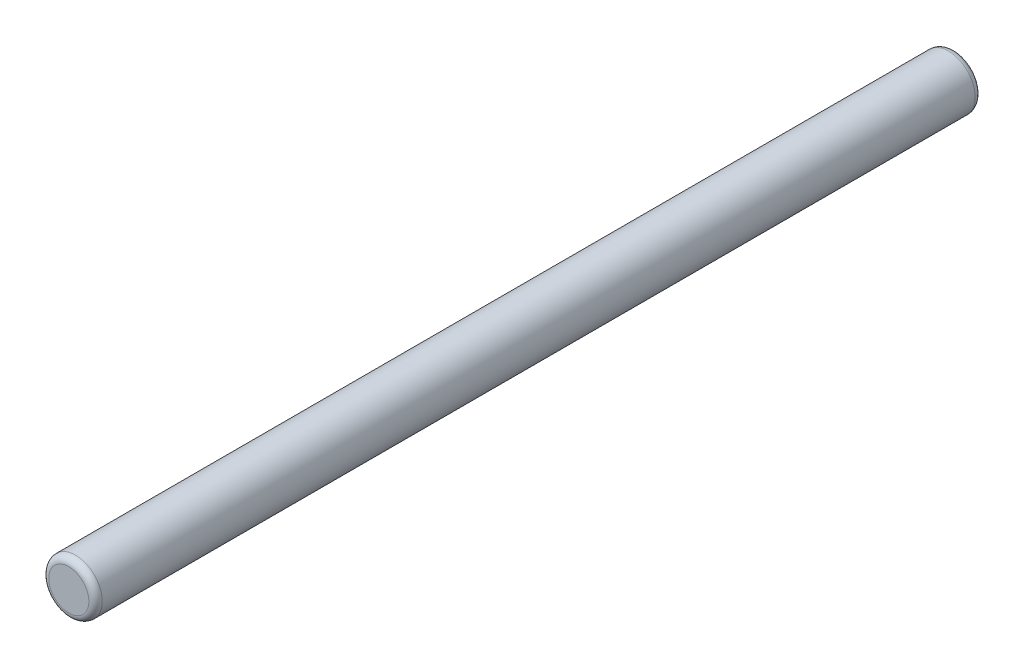
ISO-10303-21;
HEADER;
FILE_DESCRIPTION(('STEP AP214'),'2;1');
FILE_NAME('part.step','',(''),(''),'','','');
FILE_SCHEMA(('AUTOMOTIVE_DESIGN { 1 0 10303 214 1 1 1 1 }'));
ENDSEC;
DATA;
#1=APPLICATION_CONTEXT('core data for automotive mechanical design processes');
#2=APPLICATION_PROTOCOL_DEFINITION('international standard','automotive_design',2000,#1);
#3=PRODUCT_CONTEXT('',#1,'mechanical');
#4=PRODUCT('Part','Part','',(#3));
#5=PRODUCT_RELATED_PRODUCT_CATEGORY('part','',(#4));
#6=PRODUCT_DEFINITION_FORMATION('','',#4);
#7=PRODUCT_DEFINITION_CONTEXT('part definition',#1,'design');
#8=PRODUCT_DEFINITION('design','',#6,#7);
#9=PRODUCT_DEFINITION_SHAPE('','',#8);
#10=(LENGTH_UNIT() NAMED_UNIT(*) SI_UNIT(.MILLI.,.METRE.));
#11=(NAMED_UNIT(*) PLANE_ANGLE_UNIT() SI_UNIT($,.RADIAN.));
#12=(NAMED_UNIT(*) SI_UNIT($,.STERADIAN.) SOLID_ANGLE_UNIT());
#13=UNCERTAINTY_MEASURE_WITH_UNIT(LENGTH_MEASURE(1.E-05),#10,'distance_accuracy_value','');
#14=(GEOMETRIC_REPRESENTATION_CONTEXT(3) GLOBAL_UNCERTAINTY_ASSIGNED_CONTEXT((#13)) GLOBAL_UNIT_ASSIGNED_CONTEXT((#10,
#11,#12)) REPRESENTATION_CONTEXT('',''));
#15=CARTESIAN_POINT('',(0.,0.,0.));
#16=DIRECTION('',(0.,0.,1.));
#17=DIRECTION('',(1.,0.,0.));
#18=AXIS2_PLACEMENT_3D('',#15,#16,#17);
#19=CARTESIAN_POINT('',(0.,0.,132.5));
#20=DIRECTION('',(0.,0.,-1.));
#21=DIRECTION('',(-1.,0.,0.));
#22=AXIS2_PLACEMENT_3D('',#19,#20,#21);
#23=CYLINDRICAL_SURFACE('',#22,4.);
#24=CARTESIAN_POINT('',(0.,0.,131.5));
#25=DIRECTION('',(0.,0.,1.));
#26=DIRECTION('',(1.,0.,0.));
#27=AXIS2_PLACEMENT_3D('',#24,#25,#26);
#28=CIRCLE('',#27,4.);
#29=CARTESIAN_POINT('',(4.,0.,131.5));
#30=VERTEX_POINT('',#29);
#31=EDGE_CURVE('E40',#30,#30,#28,.F.);
#32=ORIENTED_EDGE('',*,*,#31,.T.);
#33=EDGE_LOOP('',(#32));
#34=FACE_BOUND('',#33,.T.);
#35=CARTESIAN_POINT('',(0.,0.,1.));
#36=DIRECTION('',(0.,0.,1.));
#37=DIRECTION('',(1.,0.,0.));
#38=AXIS2_PLACEMENT_3D('',#35,#36,#37);
#39=CIRCLE('',#38,4.);
#40=CARTESIAN_POINT('',(4.,0.,1.));
#41=VERTEX_POINT('',#40);
#42=EDGE_CURVE('E44',#41,#41,#39,.T.);
#43=ORIENTED_EDGE('',*,*,#42,.T.);
#44=EDGE_LOOP('',(#43));
#45=FACE_BOUND('',#44,.T.);
#46=ADVANCED_FACE('F33',(#34,#45),#23,.T.);
#47=CARTESIAN_POINT('',(0.,0.,132.5));
#48=DIRECTION('',(0.,0.,1.));
#49=DIRECTION('',(1.,0.,0.));
#50=AXIS2_PLACEMENT_3D('',#47,#48,#49);
#51=PLANE('',#50);
#52=CARTESIAN_POINT('',(0.,0.,132.5));
#53=DIRECTION('',(0.,0.,1.));
#54=DIRECTION('',(1.,0.,0.));
#55=AXIS2_PLACEMENT_3D('',#52,#53,#54);
#56=CIRCLE('',#55,3.);
#57=CARTESIAN_POINT('',(3.,0.,132.5));
#58=VERTEX_POINT('',#57);
#59=EDGE_CURVE('E48',#58,#58,#56,.T.);
#60=ORIENTED_EDGE('',*,*,#59,.T.);
#61=EDGE_LOOP('',(#60));
#62=FACE_BOUND('',#61,.T.);
#63=ADVANCED_FACE('F54',(#62),#51,.T.);
#64=CARTESIAN_POINT('',(0.,0.,0.));
#65=DIRECTION('',(0.,0.,1.));
#66=DIRECTION('',(1.,0.,0.));
#67=AXIS2_PLACEMENT_3D('',#64,#65,#66);
#68=PLANE('',#67);
#69=CARTESIAN_POINT('',(0.,0.,0.));
#70=DIRECTION('',(0.,0.,1.));
#71=DIRECTION('',(1.,0.,0.));
#72=AXIS2_PLACEMENT_3D('',#69,#70,#71);
#73=CIRCLE('',#72,3.);
#74=CARTESIAN_POINT('',(3.,0.,0.));
#75=VERTEX_POINT('',#74);
#76=EDGE_CURVE('E10',#75,#75,#73,.F.);
#77=ORIENTED_EDGE('',*,*,#76,.T.);
#78=EDGE_LOOP('',(#77));
#79=FACE_BOUND('',#78,.T.);
#80=ADVANCED_FACE('F58',(#79),#68,.F.);
#81=CARTESIAN_POINT('',(0.,0.,131.5));
#82=DIRECTION('',(0.,0.,1.));
#83=DIRECTION('',(1.,0.,0.));
#84=AXIS2_PLACEMENT_3D('',#81,#82,#83);
#85=TOROIDAL_SURFACE('',#84,3.,1.);
#86=ORIENTED_EDGE('',*,*,#31,.F.);
#87=EDGE_LOOP('',(#86));
#88=FACE_BOUND('',#87,.T.);
#89=ORIENTED_EDGE('',*,*,#59,.F.);
#90=EDGE_LOOP('',(#89));
#91=FACE_BOUND('',#90,.T.);
#92=ADVANCED_FACE('F56',(#88,#91),#85,.T.);
#93=CARTESIAN_POINT('',(0.,0.,1.));
#94=DIRECTION('',(0.,0.,1.));
#95=DIRECTION('',(1.,0.,0.));
#96=AXIS2_PLACEMENT_3D('',#93,#94,#95);
#97=TOROIDAL_SURFACE('',#96,3.,1.);
#98=ORIENTED_EDGE('',*,*,#76,.F.);
#99=EDGE_LOOP('',(#98));
#100=FACE_BOUND('',#99,.T.);
#101=ORIENTED_EDGE('',*,*,#42,.F.);
#102=EDGE_LOOP('',(#101));
#103=FACE_BOUND('',#102,.T.);
#104=ADVANCED_FACE('F35',(#100,#103),#97,.T.);
#105=CLOSED_SHELL('',(#46,#63,#80,#92,#104));
#106=MANIFOLD_SOLID_BREP('B2',#105);
#107=ADVANCED_BREP_SHAPE_REPRESENTATION('',(#18,#106),#14);
#108=SHAPE_DEFINITION_REPRESENTATION(#9,#107);
ENDSEC;
END-ISO-10303-21;
